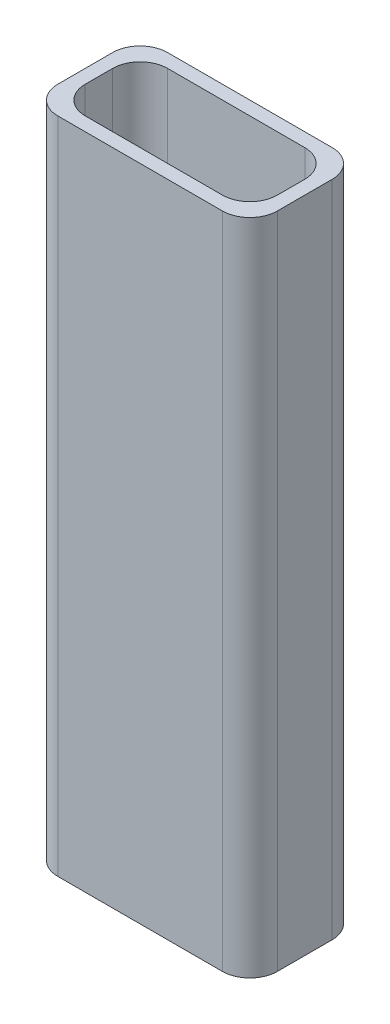
ISO-10303-21;
HEADER;
FILE_DESCRIPTION(('STEP AP214'),'2;1');
FILE_NAME('part.step','',(''),(''),'','','');
FILE_SCHEMA(('AUTOMOTIVE_DESIGN { 1 0 10303 214 1 1 1 1 }'));
ENDSEC;
DATA;
#1=APPLICATION_CONTEXT('core data for automotive mechanical design processes');
#2=APPLICATION_PROTOCOL_DEFINITION('international standard','automotive_design',2000,#1);
#3=PRODUCT_CONTEXT('',#1,'mechanical');
#4=PRODUCT('Part','Part','',(#3));
#5=PRODUCT_RELATED_PRODUCT_CATEGORY('part','',(#4));
#6=PRODUCT_DEFINITION_FORMATION('','',#4);
#7=PRODUCT_DEFINITION_CONTEXT('part definition',#1,'design');
#8=PRODUCT_DEFINITION('design','',#6,#7);
#9=PRODUCT_DEFINITION_SHAPE('','',#8);
#10=(LENGTH_UNIT() NAMED_UNIT(*) SI_UNIT(.MILLI.,.METRE.));
#11=(NAMED_UNIT(*) PLANE_ANGLE_UNIT() SI_UNIT($,.RADIAN.));
#12=(NAMED_UNIT(*) SI_UNIT($,.STERADIAN.) SOLID_ANGLE_UNIT());
#13=UNCERTAINTY_MEASURE_WITH_UNIT(LENGTH_MEASURE(1.E-05),#10,'distance_accuracy_value','');
#14=(GEOMETRIC_REPRESENTATION_CONTEXT(3) GLOBAL_UNCERTAINTY_ASSIGNED_CONTEXT((#13)) GLOBAL_UNIT_ASSIGNED_CONTEXT((#10,
#11,#12)) REPRESENTATION_CONTEXT('',''));
#15=CARTESIAN_POINT('',(0.,0.,0.));
#16=DIRECTION('',(0.,0.,1.));
#17=DIRECTION('',(1.,0.,0.));
#18=AXIS2_PLACEMENT_3D('',#15,#16,#17);
#19=CARTESIAN_POINT('',(-15.,60.,-5.));
#20=DIRECTION('',(0.,-1.,0.));
#21=DIRECTION('',(0.,0.,-1.));
#22=AXIS2_PLACEMENT_3D('',#19,#20,#21);
#23=CYLINDRICAL_SURFACE('',#22,5.);
#24=CARTESIAN_POINT('',(-15.,-60.,-5.));
#25=DIRECTION('',(0.,1.,0.));
#26=DIRECTION('',(0.,0.,1.));
#27=AXIS2_PLACEMENT_3D('',#24,#25,#26);
#28=CIRCLE('',#27,5.);
#29=CARTESIAN_POINT('',(-15.,-60.,-9.99999999999999));
#30=VERTEX_POINT('',#29);
#31=CARTESIAN_POINT('',(-20.,-60.,-5.));
#32=VERTEX_POINT('',#31);
#33=EDGE_CURVE('E226',#30,#32,#28,.T.);
#34=ORIENTED_EDGE('',*,*,#33,.T.);
#35=DIRECTION('',(0.,-1.,0.));
#36=VECTOR('',#35,1.);
#37=CARTESIAN_POINT('',(-20.,60.,-5.));
#38=LINE('',#37,#36);
#39=CARTESIAN_POINT('',(-20.,60.,-5.));
#40=VERTEX_POINT('',#39);
#41=EDGE_CURVE('E11',#40,#32,#38,.T.);
#42=ORIENTED_EDGE('',*,*,#41,.F.);
#43=CARTESIAN_POINT('',(-15.,60.,-5.));
#44=DIRECTION('',(0.,1.,0.));
#45=DIRECTION('',(0.,0.,1.));
#46=AXIS2_PLACEMENT_3D('',#43,#44,#45);
#47=CIRCLE('',#46,5.);
#48=CARTESIAN_POINT('',(-15.,60.,-9.99999999999999));
#49=VERTEX_POINT('',#48);
#50=EDGE_CURVE('E244',#49,#40,#47,.T.);
#51=ORIENTED_EDGE('',*,*,#50,.F.);
#52=DIRECTION('',(0.,-1.,0.));
#53=VECTOR('',#52,1.);
#54=CARTESIAN_POINT('',(-15.,60.,-9.99999999999999));
#55=LINE('',#54,#53);
#56=EDGE_CURVE('E270',#49,#30,#55,.T.);
#57=ORIENTED_EDGE('',*,*,#56,.T.);
#58=EDGE_LOOP('',(#34,#42,#51,#57));
#59=FACE_BOUND('',#58,.T.);
#60=ADVANCED_FACE('F38',(#59),#23,.T.);
#61=CARTESIAN_POINT('',(-20.,60.,5.));
#62=DIRECTION('',(1.,0.,0.));
#63=DIRECTION('',(0.,0.,-1.));
#64=AXIS2_PLACEMENT_3D('',#61,#62,#63);
#65=PLANE('',#64);
#66=DIRECTION('',(0.,0.,1.));
#67=VECTOR('',#66,1.);
#68=CARTESIAN_POINT('',(-20.,-60.,5.));
#69=LINE('',#68,#67);
#70=CARTESIAN_POINT('',(-20.,-60.,5.));
#71=VERTEX_POINT('',#70);
#72=EDGE_CURVE('E274',#32,#71,#69,.T.);
#73=ORIENTED_EDGE('',*,*,#72,.T.);
#74=DIRECTION('',(0.,-1.,0.));
#75=VECTOR('',#74,1.);
#76=CARTESIAN_POINT('',(-20.,60.,5.));
#77=LINE('',#76,#75);
#78=CARTESIAN_POINT('',(-20.,60.,5.));
#79=VERTEX_POINT('',#78);
#80=EDGE_CURVE('E46',#79,#71,#77,.T.);
#81=ORIENTED_EDGE('',*,*,#80,.F.);
#82=DIRECTION('',(0.,0.,1.));
#83=VECTOR('',#82,1.);
#84=CARTESIAN_POINT('',(-20.,60.,5.));
#85=LINE('',#84,#83);
#86=EDGE_CURVE('E248',#40,#79,#85,.T.);
#87=ORIENTED_EDGE('',*,*,#86,.F.);
#88=ORIENTED_EDGE('',*,*,#41,.T.);
#89=EDGE_LOOP('',(#73,#81,#87,#88));
#90=FACE_BOUND('',#89,.T.);
#91=ADVANCED_FACE('F343',(#90),#65,.F.);
#92=CARTESIAN_POINT('',(-15.,60.,5.));
#93=DIRECTION('',(0.,-1.,0.));
#94=DIRECTION('',(0.,0.,-1.));
#95=AXIS2_PLACEMENT_3D('',#92,#93,#94);
#96=CYLINDRICAL_SURFACE('',#95,5.);
#97=CARTESIAN_POINT('',(-15.,-60.,5.));
#98=DIRECTION('',(0.,1.,0.));
#99=DIRECTION('',(0.,0.,-1.));
#100=AXIS2_PLACEMENT_3D('',#97,#98,#99);
#101=CIRCLE('',#100,5.);
#102=CARTESIAN_POINT('',(-15.,-60.,10.));
#103=VERTEX_POINT('',#102);
#104=EDGE_CURVE('E277',#71,#103,#101,.T.);
#105=ORIENTED_EDGE('',*,*,#104,.T.);
#106=DIRECTION('',(0.,-1.,0.));
#107=VECTOR('',#106,1.);
#108=CARTESIAN_POINT('',(-15.,60.,10.));
#109=LINE('',#108,#107);
#110=CARTESIAN_POINT('',(-15.,60.,10.));
#111=VERTEX_POINT('',#110);
#112=EDGE_CURVE('E313',#111,#103,#109,.T.);
#113=ORIENTED_EDGE('',*,*,#112,.F.);
#114=CARTESIAN_POINT('',(-15.,60.,5.));
#115=DIRECTION('',(0.,1.,0.));
#116=DIRECTION('',(0.,0.,-1.));
#117=AXIS2_PLACEMENT_3D('',#114,#115,#116);
#118=CIRCLE('',#117,5.);
#119=EDGE_CURVE('E252',#79,#111,#118,.T.);
#120=ORIENTED_EDGE('',*,*,#119,.F.);
#121=ORIENTED_EDGE('',*,*,#80,.T.);
#122=EDGE_LOOP('',(#105,#113,#120,#121));
#123=FACE_BOUND('',#122,.T.);
#124=ADVANCED_FACE('F322',(#123),#96,.T.);
#125=CARTESIAN_POINT('',(15.,60.,10.));
#126=DIRECTION('',(0.,0.,-1.));
#127=DIRECTION('',(-1.,0.,0.));
#128=AXIS2_PLACEMENT_3D('',#125,#126,#127);
#129=PLANE('',#128);
#130=DIRECTION('',(1.,0.,0.));
#131=VECTOR('',#130,1.);
#132=CARTESIAN_POINT('',(15.,-60.,10.));
#133=LINE('',#132,#131);
#134=CARTESIAN_POINT('',(15.,-60.,10.));
#135=VERTEX_POINT('',#134);
#136=EDGE_CURVE('E280',#103,#135,#133,.T.);
#137=ORIENTED_EDGE('',*,*,#136,.T.);
#138=DIRECTION('',(0.,-1.,0.));
#139=VECTOR('',#138,1.);
#140=CARTESIAN_POINT('',(15.,60.,10.));
#141=LINE('',#140,#139);
#142=CARTESIAN_POINT('',(15.,60.,10.));
#143=VERTEX_POINT('',#142);
#144=EDGE_CURVE('E309',#143,#135,#141,.T.);
#145=ORIENTED_EDGE('',*,*,#144,.F.);
#146=DIRECTION('',(1.,0.,0.));
#147=VECTOR('',#146,1.);
#148=CARTESIAN_POINT('',(15.,60.,10.));
#149=LINE('',#148,#147);
#150=EDGE_CURVE('E255',#111,#143,#149,.T.);
#151=ORIENTED_EDGE('',*,*,#150,.F.);
#152=ORIENTED_EDGE('',*,*,#112,.T.);
#153=EDGE_LOOP('',(#137,#145,#151,#152));
#154=FACE_BOUND('',#153,.T.);
#155=ADVANCED_FACE('F331',(#154),#129,.F.);
#156=CARTESIAN_POINT('',(15.,60.,5.));
#157=DIRECTION('',(0.,-1.,0.));
#158=DIRECTION('',(0.,0.,-1.));
#159=AXIS2_PLACEMENT_3D('',#156,#157,#158);
#160=CYLINDRICAL_SURFACE('',#159,5.);
#161=CARTESIAN_POINT('',(15.,-60.,5.));
#162=DIRECTION('',(0.,1.,0.));
#163=DIRECTION('',(0.,0.,1.));
#164=AXIS2_PLACEMENT_3D('',#161,#162,#163);
#165=CIRCLE('',#164,5.);
#166=CARTESIAN_POINT('',(20.,-60.,5.));
#167=VERTEX_POINT('',#166);
#168=EDGE_CURVE('E283',#135,#167,#165,.T.);
#169=ORIENTED_EDGE('',*,*,#168,.T.);
#170=DIRECTION('',(0.,-1.,0.));
#171=VECTOR('',#170,1.);
#172=CARTESIAN_POINT('',(20.,60.,5.));
#173=LINE('',#172,#171);
#174=CARTESIAN_POINT('',(20.,60.,5.));
#175=VERTEX_POINT('',#174);
#176=EDGE_CURVE('E305',#175,#167,#173,.T.);
#177=ORIENTED_EDGE('',*,*,#176,.F.);
#178=CARTESIAN_POINT('',(15.,60.,5.));
#179=DIRECTION('',(0.,1.,0.));
#180=DIRECTION('',(0.,0.,1.));
#181=AXIS2_PLACEMENT_3D('',#178,#179,#180);
#182=CIRCLE('',#181,5.);
#183=EDGE_CURVE('E258',#143,#175,#182,.T.);
#184=ORIENTED_EDGE('',*,*,#183,.F.);
#185=ORIENTED_EDGE('',*,*,#144,.T.);
#186=EDGE_LOOP('',(#169,#177,#184,#185));
#187=FACE_BOUND('',#186,.T.);
#188=ADVANCED_FACE('F335',(#187),#160,.T.);
#189=CARTESIAN_POINT('',(20.,60.,5.));
#190=DIRECTION('',(-1.,0.,0.));
#191=DIRECTION('',(0.,0.,1.));
#192=AXIS2_PLACEMENT_3D('',#189,#190,#191);
#193=PLANE('',#192);
#194=DIRECTION('',(0.,0.,-1.));
#195=VECTOR('',#194,1.);
#196=CARTESIAN_POINT('',(20.,-60.,5.));
#197=LINE('',#196,#195);
#198=CARTESIAN_POINT('',(20.,-60.,-5.));
#199=VERTEX_POINT('',#198);
#200=EDGE_CURVE('E286',#167,#199,#197,.T.);
#201=ORIENTED_EDGE('',*,*,#200,.T.);
#202=DIRECTION('',(0.,-1.,0.));
#203=VECTOR('',#202,1.);
#204=CARTESIAN_POINT('',(20.,60.,-5.));
#205=LINE('',#204,#203);
#206=CARTESIAN_POINT('',(20.,60.,-5.));
#207=VERTEX_POINT('',#206);
#208=EDGE_CURVE('E301',#207,#199,#205,.T.);
#209=ORIENTED_EDGE('',*,*,#208,.F.);
#210=DIRECTION('',(0.,0.,-1.));
#211=VECTOR('',#210,1.);
#212=CARTESIAN_POINT('',(20.,60.,5.));
#213=LINE('',#212,#211);
#214=EDGE_CURVE('E261',#175,#207,#213,.T.);
#215=ORIENTED_EDGE('',*,*,#214,.F.);
#216=ORIENTED_EDGE('',*,*,#176,.T.);
#217=EDGE_LOOP('',(#201,#209,#215,#216));
#218=FACE_BOUND('',#217,.T.);
#219=ADVANCED_FACE('F356',(#218),#193,.F.);
#220=CARTESIAN_POINT('',(15.,60.,-5.));
#221=DIRECTION('',(0.,-1.,0.));
#222=DIRECTION('',(0.,0.,-1.));
#223=AXIS2_PLACEMENT_3D('',#220,#221,#222);
#224=CYLINDRICAL_SURFACE('',#223,5.);
#225=CARTESIAN_POINT('',(15.,-60.,-5.));
#226=DIRECTION('',(0.,1.,0.));
#227=DIRECTION('',(0.,0.,1.));
#228=AXIS2_PLACEMENT_3D('',#225,#226,#227);
#229=CIRCLE('',#228,5.);
#230=CARTESIAN_POINT('',(15.,-60.,-10.));
#231=VERTEX_POINT('',#230);
#232=EDGE_CURVE('E289',#199,#231,#229,.T.);
#233=ORIENTED_EDGE('',*,*,#232,.T.);
#234=DIRECTION('',(0.,-1.,0.));
#235=VECTOR('',#234,1.);
#236=CARTESIAN_POINT('',(15.,60.,-10.));
#237=LINE('',#236,#235);
#238=CARTESIAN_POINT('',(15.,60.,-10.));
#239=VERTEX_POINT('',#238);
#240=EDGE_CURVE('E297',#239,#231,#237,.T.);
#241=ORIENTED_EDGE('',*,*,#240,.F.);
#242=CARTESIAN_POINT('',(15.,60.,-5.));
#243=DIRECTION('',(0.,1.,0.));
#244=DIRECTION('',(0.,0.,1.));
#245=AXIS2_PLACEMENT_3D('',#242,#243,#244);
#246=CIRCLE('',#245,5.);
#247=EDGE_CURVE('E264',#207,#239,#246,.T.);
#248=ORIENTED_EDGE('',*,*,#247,.F.);
#249=ORIENTED_EDGE('',*,*,#208,.T.);
#250=EDGE_LOOP('',(#233,#241,#248,#249));
#251=FACE_BOUND('',#250,.T.);
#252=ADVANCED_FACE('F354',(#251),#224,.T.);
#253=CARTESIAN_POINT('',(15.,60.,-10.));
#254=DIRECTION('',(0.,0.,1.));
#255=DIRECTION('',(1.,0.,0.));
#256=AXIS2_PLACEMENT_3D('',#253,#254,#255);
#257=PLANE('',#256);
#258=DIRECTION('',(-1.,0.,0.));
#259=VECTOR('',#258,1.);
#260=CARTESIAN_POINT('',(15.,-60.,-10.));
#261=LINE('',#260,#259);
#262=EDGE_CURVE('E249',#231,#30,#261,.T.);
#263=ORIENTED_EDGE('',*,*,#262,.T.);
#264=ORIENTED_EDGE('',*,*,#56,.F.);
#265=DIRECTION('',(-1.,0.,0.));
#266=VECTOR('',#265,1.);
#267=CARTESIAN_POINT('',(15.,60.,-10.));
#268=LINE('',#267,#266);
#269=EDGE_CURVE('E267',#239,#49,#268,.T.);
#270=ORIENTED_EDGE('',*,*,#269,.F.);
#271=ORIENTED_EDGE('',*,*,#240,.T.);
#272=EDGE_LOOP('',(#263,#264,#270,#271));
#273=FACE_BOUND('',#272,.T.);
#274=ADVANCED_FACE('F349',(#273),#257,.F.);
#275=CARTESIAN_POINT('',(-15.,60.,-5.));
#276=DIRECTION('',(0.,1.,0.));
#277=DIRECTION('',(0.,0.,1.));
#278=AXIS2_PLACEMENT_3D('',#275,#276,#277);
#279=PLANE('',#278);
#280=CARTESIAN_POINT('',(-12.5,60.,-2.5));
#281=DIRECTION('',(0.,1.,0.));
#282=DIRECTION('',(0.,0.,1.));
#283=AXIS2_PLACEMENT_3D('',#280,#281,#282);
#284=CIRCLE('',#283,5.);
#285=CARTESIAN_POINT('',(-12.5,60.,-7.5));
#286=VERTEX_POINT('',#285);
#287=CARTESIAN_POINT('',(-17.5,60.,-2.5));
#288=VERTEX_POINT('',#287);
#289=EDGE_CURVE('E53',#286,#288,#284,.T.);
#290=ORIENTED_EDGE('',*,*,#289,.F.);
#291=DIRECTION('',(-1.,0.,0.));
#292=VECTOR('',#291,1.);
#293=CARTESIAN_POINT('',(12.5,60.,-7.5));
#294=LINE('',#293,#292);
#295=CARTESIAN_POINT('',(12.5,60.,-7.5));
#296=VERTEX_POINT('',#295);
#297=EDGE_CURVE('E173',#296,#286,#294,.T.);
#298=ORIENTED_EDGE('',*,*,#297,.F.);
#299=CARTESIAN_POINT('',(12.5,60.,-2.5));
#300=DIRECTION('',(0.,1.,0.));
#301=DIRECTION('',(0.,0.,1.));
#302=AXIS2_PLACEMENT_3D('',#299,#300,#301);
#303=CIRCLE('',#302,5.);
#304=CARTESIAN_POINT('',(17.5,60.,-2.5));
#305=VERTEX_POINT('',#304);
#306=EDGE_CURVE('E177',#305,#296,#303,.T.);
#307=ORIENTED_EDGE('',*,*,#306,.F.);
#308=DIRECTION('',(0.,0.,-1.));
#309=VECTOR('',#308,1.);
#310=CARTESIAN_POINT('',(17.5,60.,2.5));
#311=LINE('',#310,#309);
#312=CARTESIAN_POINT('',(17.5,60.,2.5));
#313=VERTEX_POINT('',#312);
#314=EDGE_CURVE('E216',#313,#305,#311,.T.);
#315=ORIENTED_EDGE('',*,*,#314,.F.);
#316=CARTESIAN_POINT('',(12.5,60.,2.5));
#317=DIRECTION('',(0.,1.,0.));
#318=DIRECTION('',(0.,0.,1.));
#319=AXIS2_PLACEMENT_3D('',#316,#317,#318);
#320=CIRCLE('',#319,5.);
#321=CARTESIAN_POINT('',(12.5,60.,7.5));
#322=VERTEX_POINT('',#321);
#323=EDGE_CURVE('E212',#322,#313,#320,.T.);
#324=ORIENTED_EDGE('',*,*,#323,.F.);
#325=DIRECTION('',(1.,0.,0.));
#326=VECTOR('',#325,1.);
#327=CARTESIAN_POINT('',(12.5,60.,7.5));
#328=LINE('',#327,#326);
#329=CARTESIAN_POINT('',(-12.5,60.,7.5));
#330=VERTEX_POINT('',#329);
#331=EDGE_CURVE('E208',#330,#322,#328,.T.);
#332=ORIENTED_EDGE('',*,*,#331,.F.);
#333=CARTESIAN_POINT('',(-12.5,60.,2.5));
#334=DIRECTION('',(0.,1.,0.));
#335=DIRECTION('',(0.,0.,-1.));
#336=AXIS2_PLACEMENT_3D('',#333,#334,#335);
#337=CIRCLE('',#336,5.);
#338=CARTESIAN_POINT('',(-17.5,60.,2.5));
#339=VERTEX_POINT('',#338);
#340=EDGE_CURVE('E204',#339,#330,#337,.T.);
#341=ORIENTED_EDGE('',*,*,#340,.F.);
#342=DIRECTION('',(0.,0.,1.));
#343=VECTOR('',#342,1.);
#344=CARTESIAN_POINT('',(-17.5,60.,2.5));
#345=LINE('',#344,#343);
#346=EDGE_CURVE('E201',#288,#339,#345,.T.);
#347=ORIENTED_EDGE('',*,*,#346,.F.);
#348=EDGE_LOOP('',(#290,#298,#307,#315,#324,#332,#341,#347));
#349=FACE_BOUND('',#348,.T.);
#350=ORIENTED_EDGE('',*,*,#50,.T.);
#351=ORIENTED_EDGE('',*,*,#86,.T.);
#352=ORIENTED_EDGE('',*,*,#119,.T.);
#353=ORIENTED_EDGE('',*,*,#150,.T.);
#354=ORIENTED_EDGE('',*,*,#183,.T.);
#355=ORIENTED_EDGE('',*,*,#214,.T.);
#356=ORIENTED_EDGE('',*,*,#247,.T.);
#357=ORIENTED_EDGE('',*,*,#269,.T.);
#358=EDGE_LOOP('',(#350,#351,#352,#353,#354,#355,#356,#357));
#359=FACE_BOUND('',#358,.T.);
#360=ADVANCED_FACE('F339',(#349,#359),#279,.T.);
#361=CARTESIAN_POINT('',(-15.,-60.,-5.));
#362=DIRECTION('',(0.,1.,0.));
#363=DIRECTION('',(0.,0.,1.));
#364=AXIS2_PLACEMENT_3D('',#361,#362,#363);
#365=PLANE('',#364);
#366=DIRECTION('',(-1.,0.,0.));
#367=VECTOR('',#366,1.);
#368=CARTESIAN_POINT('',(12.5,-60.,-7.5));
#369=LINE('',#368,#367);
#370=CARTESIAN_POINT('',(12.5,-60.,-7.5));
#371=VERTEX_POINT('',#370);
#372=CARTESIAN_POINT('',(-12.5,-60.,-7.5));
#373=VERTEX_POINT('',#372);
#374=EDGE_CURVE('E160',#371,#373,#369,.T.);
#375=ORIENTED_EDGE('',*,*,#374,.T.);
#376=CARTESIAN_POINT('',(-12.5,-60.,-2.5));
#377=DIRECTION('',(0.,1.,0.));
#378=DIRECTION('',(0.,0.,1.));
#379=AXIS2_PLACEMENT_3D('',#376,#377,#378);
#380=CIRCLE('',#379,5.);
#381=CARTESIAN_POINT('',(-17.5,-60.,-2.5));
#382=VERTEX_POINT('',#381);
#383=EDGE_CURVE('E153',#373,#382,#380,.T.);
#384=ORIENTED_EDGE('',*,*,#383,.T.);
#385=DIRECTION('',(0.,0.,1.));
#386=VECTOR('',#385,1.);
#387=CARTESIAN_POINT('',(-17.5,-60.,2.5));
#388=LINE('',#387,#386);
#389=CARTESIAN_POINT('',(-17.5,-60.,2.5));
#390=VERTEX_POINT('',#389);
#391=EDGE_CURVE('E163',#382,#390,#388,.T.);
#392=ORIENTED_EDGE('',*,*,#391,.T.);
#393=CARTESIAN_POINT('',(-12.5,-60.,2.5));
#394=DIRECTION('',(0.,1.,0.));
#395=DIRECTION('',(0.,0.,-1.));
#396=AXIS2_PLACEMENT_3D('',#393,#394,#395);
#397=CIRCLE('',#396,5.);
#398=CARTESIAN_POINT('',(-12.5,-60.,7.5));
#399=VERTEX_POINT('',#398);
#400=EDGE_CURVE('E61',#390,#399,#397,.T.);
#401=ORIENTED_EDGE('',*,*,#400,.T.);
#402=DIRECTION('',(1.,0.,0.));
#403=VECTOR('',#402,1.);
#404=CARTESIAN_POINT('',(12.5,-60.,7.5));
#405=LINE('',#404,#403);
#406=CARTESIAN_POINT('',(12.5,-60.,7.5));
#407=VERTEX_POINT('',#406);
#408=EDGE_CURVE('E182',#399,#407,#405,.T.);
#409=ORIENTED_EDGE('',*,*,#408,.T.);
#410=CARTESIAN_POINT('',(12.5,-60.,2.5));
#411=DIRECTION('',(0.,1.,0.));
#412=DIRECTION('',(0.,0.,1.));
#413=AXIS2_PLACEMENT_3D('',#410,#411,#412);
#414=CIRCLE('',#413,5.);
#415=CARTESIAN_POINT('',(17.5,-60.,2.5));
#416=VERTEX_POINT('',#415);
#417=EDGE_CURVE('E186',#407,#416,#414,.T.);
#418=ORIENTED_EDGE('',*,*,#417,.T.);
#419=DIRECTION('',(0.,0.,-1.));
#420=VECTOR('',#419,1.);
#421=CARTESIAN_POINT('',(17.5,-60.,2.5));
#422=LINE('',#421,#420);
#423=CARTESIAN_POINT('',(17.5,-60.,-2.5));
#424=VERTEX_POINT('',#423);
#425=EDGE_CURVE('E190',#416,#424,#422,.T.);
#426=ORIENTED_EDGE('',*,*,#425,.T.);
#427=CARTESIAN_POINT('',(12.5,-60.,-2.5));
#428=DIRECTION('',(0.,1.,0.));
#429=DIRECTION('',(0.,0.,1.));
#430=AXIS2_PLACEMENT_3D('',#427,#428,#429);
#431=CIRCLE('',#430,5.);
#432=EDGE_CURVE('E194',#424,#371,#431,.T.);
#433=ORIENTED_EDGE('',*,*,#432,.T.);
#434=EDGE_LOOP('',(#375,#384,#392,#401,#409,#418,#426,#433));
#435=FACE_BOUND('',#434,.T.);
#436=ORIENTED_EDGE('',*,*,#33,.F.);
#437=ORIENTED_EDGE('',*,*,#262,.F.);
#438=ORIENTED_EDGE('',*,*,#232,.F.);
#439=ORIENTED_EDGE('',*,*,#200,.F.);
#440=ORIENTED_EDGE('',*,*,#168,.F.);
#441=ORIENTED_EDGE('',*,*,#136,.F.);
#442=ORIENTED_EDGE('',*,*,#104,.F.);
#443=ORIENTED_EDGE('',*,*,#72,.F.);
#444=EDGE_LOOP('',(#436,#437,#438,#439,#440,#441,#442,#443));
#445=FACE_BOUND('',#444,.T.);
#446=ADVANCED_FACE('F168',(#435,#445),#365,.F.);
#447=CARTESIAN_POINT('',(-12.5,-60.,-2.5));
#448=DIRECTION('',(0.,1.,0.));
#449=DIRECTION('',(0.,0.,1.));
#450=AXIS2_PLACEMENT_3D('',#447,#448,#449);
#451=CYLINDRICAL_SURFACE('',#450,5.);
#452=ORIENTED_EDGE('',*,*,#289,.T.);
#453=DIRECTION('',(0.,1.,0.));
#454=VECTOR('',#453,1.);
#455=CARTESIAN_POINT('',(-17.5,-60.,-2.5));
#456=LINE('',#455,#454);
#457=EDGE_CURVE('E149',#382,#288,#456,.T.);
#458=ORIENTED_EDGE('',*,*,#457,.F.);
#459=ORIENTED_EDGE('',*,*,#383,.F.);
#460=DIRECTION('',(0.,1.,0.));
#461=VECTOR('',#460,1.);
#462=CARTESIAN_POINT('',(-12.5,-60.,-7.5));
#463=LINE('',#462,#461);
#464=EDGE_CURVE('E223',#373,#286,#463,.T.);
#465=ORIENTED_EDGE('',*,*,#464,.T.);
#466=EDGE_LOOP('',(#452,#458,#459,#465));
#467=FACE_BOUND('',#466,.T.);
#468=ADVANCED_FACE('F151',(#467),#451,.F.);
#469=CARTESIAN_POINT('',(12.5,-60.,-7.5));
#470=DIRECTION('',(0.,0.,-1.));
#471=DIRECTION('',(-1.,0.,0.));
#472=AXIS2_PLACEMENT_3D('',#469,#470,#471);
#473=PLANE('',#472);
#474=ORIENTED_EDGE('',*,*,#297,.T.);
#475=ORIENTED_EDGE('',*,*,#464,.F.);
#476=ORIENTED_EDGE('',*,*,#374,.F.);
#477=DIRECTION('',(0.,1.,0.));
#478=VECTOR('',#477,1.);
#479=CARTESIAN_POINT('',(12.5,-60.,-7.5));
#480=LINE('',#479,#478);
#481=EDGE_CURVE('E227',#371,#296,#480,.T.);
#482=ORIENTED_EDGE('',*,*,#481,.T.);
#483=EDGE_LOOP('',(#474,#475,#476,#482));
#484=FACE_BOUND('',#483,.T.);
#485=ADVANCED_FACE('F427',(#484),#473,.F.);
#486=CARTESIAN_POINT('',(12.5,-60.,-2.5));
#487=DIRECTION('',(0.,1.,0.));
#488=DIRECTION('',(0.,0.,1.));
#489=AXIS2_PLACEMENT_3D('',#486,#487,#488);
#490=CYLINDRICAL_SURFACE('',#489,5.);
#491=ORIENTED_EDGE('',*,*,#306,.T.);
#492=ORIENTED_EDGE('',*,*,#481,.F.);
#493=ORIENTED_EDGE('',*,*,#432,.F.);
#494=DIRECTION('',(0.,1.,0.));
#495=VECTOR('',#494,1.);
#496=CARTESIAN_POINT('',(17.5,-60.,-2.5));
#497=LINE('',#496,#495);
#498=EDGE_CURVE('E230',#424,#305,#497,.T.);
#499=ORIENTED_EDGE('',*,*,#498,.T.);
#500=EDGE_LOOP('',(#491,#492,#493,#499));
#501=FACE_BOUND('',#500,.T.);
#502=ADVANCED_FACE('F436',(#501),#490,.F.);
#503=CARTESIAN_POINT('',(17.5,-60.,2.5));
#504=DIRECTION('',(1.,0.,0.));
#505=DIRECTION('',(0.,0.,-1.));
#506=AXIS2_PLACEMENT_3D('',#503,#504,#505);
#507=PLANE('',#506);
#508=ORIENTED_EDGE('',*,*,#314,.T.);
#509=ORIENTED_EDGE('',*,*,#498,.F.);
#510=ORIENTED_EDGE('',*,*,#425,.F.);
#511=DIRECTION('',(0.,1.,0.));
#512=VECTOR('',#511,1.);
#513=CARTESIAN_POINT('',(17.5,-60.,2.5));
#514=LINE('',#513,#512);
#515=EDGE_CURVE('E233',#416,#313,#514,.T.);
#516=ORIENTED_EDGE('',*,*,#515,.T.);
#517=EDGE_LOOP('',(#508,#509,#510,#516));
#518=FACE_BOUND('',#517,.T.);
#519=ADVANCED_FACE('F446',(#518),#507,.F.);
#520=CARTESIAN_POINT('',(12.5,-60.,2.5));
#521=DIRECTION('',(0.,1.,0.));
#522=DIRECTION('',(0.,0.,1.));
#523=AXIS2_PLACEMENT_3D('',#520,#521,#522);
#524=CYLINDRICAL_SURFACE('',#523,5.);
#525=ORIENTED_EDGE('',*,*,#323,.T.);
#526=ORIENTED_EDGE('',*,*,#515,.F.);
#527=ORIENTED_EDGE('',*,*,#417,.F.);
#528=DIRECTION('',(0.,1.,0.));
#529=VECTOR('',#528,1.);
#530=CARTESIAN_POINT('',(12.5,-60.,7.5));
#531=LINE('',#530,#529);
#532=EDGE_CURVE('E236',#407,#322,#531,.T.);
#533=ORIENTED_EDGE('',*,*,#532,.T.);
#534=EDGE_LOOP('',(#525,#526,#527,#533));
#535=FACE_BOUND('',#534,.T.);
#536=ADVANCED_FACE('F456',(#535),#524,.F.);
#537=CARTESIAN_POINT('',(12.5,-60.,7.5));
#538=DIRECTION('',(0.,0.,1.));
#539=DIRECTION('',(1.,0.,0.));
#540=AXIS2_PLACEMENT_3D('',#537,#538,#539);
#541=PLANE('',#540);
#542=ORIENTED_EDGE('',*,*,#331,.T.);
#543=ORIENTED_EDGE('',*,*,#532,.F.);
#544=ORIENTED_EDGE('',*,*,#408,.F.);
#545=DIRECTION('',(0.,1.,0.));
#546=VECTOR('',#545,1.);
#547=CARTESIAN_POINT('',(-12.5,-60.,7.5));
#548=LINE('',#547,#546);
#549=EDGE_CURVE('E239',#399,#330,#548,.T.);
#550=ORIENTED_EDGE('',*,*,#549,.T.);
#551=EDGE_LOOP('',(#542,#543,#544,#550));
#552=FACE_BOUND('',#551,.T.);
#553=ADVANCED_FACE('F466',(#552),#541,.F.);
#554=CARTESIAN_POINT('',(-12.5,-60.,2.5));
#555=DIRECTION('',(0.,1.,0.));
#556=DIRECTION('',(0.,0.,1.));
#557=AXIS2_PLACEMENT_3D('',#554,#555,#556);
#558=CYLINDRICAL_SURFACE('',#557,5.);
#559=ORIENTED_EDGE('',*,*,#340,.T.);
#560=ORIENTED_EDGE('',*,*,#549,.F.);
#561=ORIENTED_EDGE('',*,*,#400,.F.);
#562=DIRECTION('',(0.,1.,0.));
#563=VECTOR('',#562,1.);
#564=CARTESIAN_POINT('',(-17.5,-60.,2.5));
#565=LINE('',#564,#563);
#566=EDGE_CURVE('E159',#390,#339,#565,.T.);
#567=ORIENTED_EDGE('',*,*,#566,.T.);
#568=EDGE_LOOP('',(#559,#560,#561,#567));
#569=FACE_BOUND('',#568,.T.);
#570=ADVANCED_FACE('F476',(#569),#558,.F.);
#571=CARTESIAN_POINT('',(-17.5,-60.,2.5));
#572=DIRECTION('',(-1.,0.,0.));
#573=DIRECTION('',(0.,0.,1.));
#574=AXIS2_PLACEMENT_3D('',#571,#572,#573);
#575=PLANE('',#574);
#576=ORIENTED_EDGE('',*,*,#346,.T.);
#577=ORIENTED_EDGE('',*,*,#566,.F.);
#578=ORIENTED_EDGE('',*,*,#391,.F.);
#579=ORIENTED_EDGE('',*,*,#457,.T.);
#580=EDGE_LOOP('',(#576,#577,#578,#579));
#581=FACE_BOUND('',#580,.T.);
#582=ADVANCED_FACE('F164',(#581),#575,.F.);
#583=CLOSED_SHELL('',(#60,#91,#124,#155,#188,#219,#252,#274,#360,#446,#468,#485,#502,#519,#536,
#553,#570,#582));
#584=MANIFOLD_SOLID_BREP('B2',#583);
#585=ADVANCED_BREP_SHAPE_REPRESENTATION('',(#18,#584),#14);
#586=SHAPE_DEFINITION_REPRESENTATION(#9,#585);
ENDSEC;
END-ISO-10303-21;
